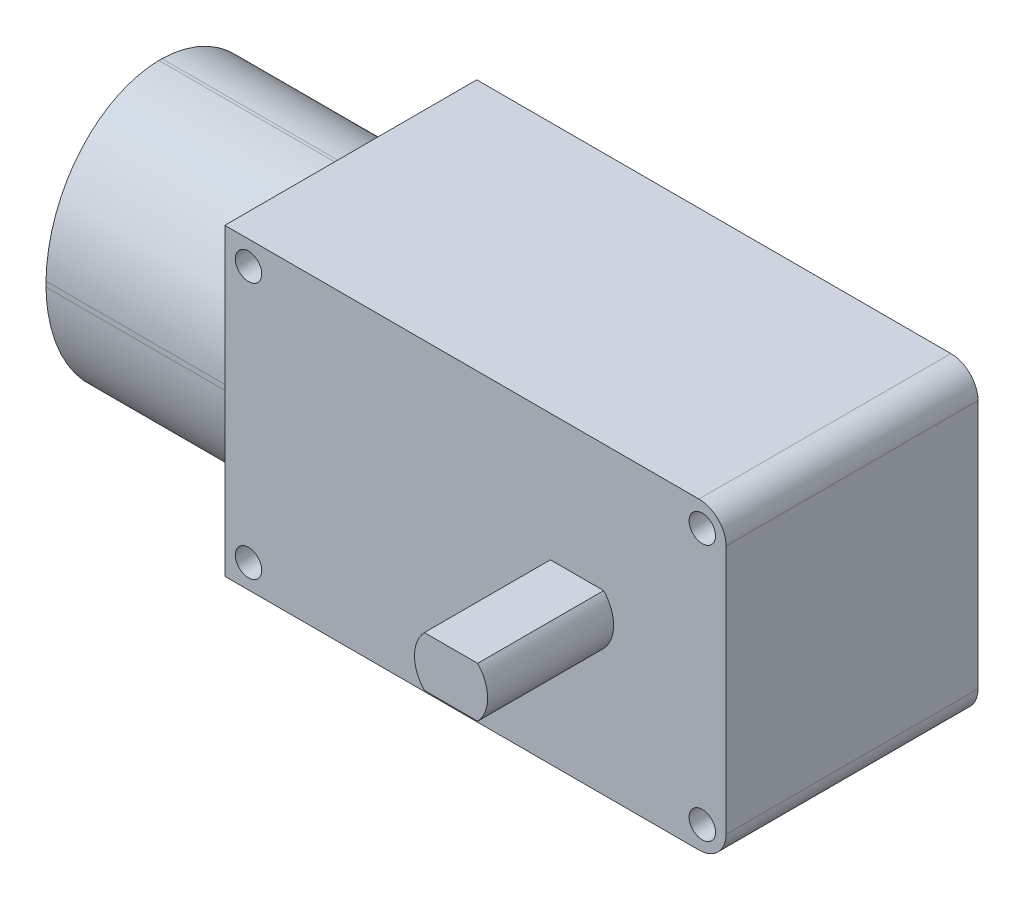
ISO-10303-21;
HEADER;
FILE_DESCRIPTION(('STEP AP214'),'2;1');
FILE_NAME('part.step','',(''),(''),'','','');
FILE_SCHEMA(('AUTOMOTIVE_DESIGN { 1 0 10303 214 1 1 1 1 }'));
ENDSEC;
DATA;
#1=APPLICATION_CONTEXT('core data for automotive mechanical design processes');
#2=APPLICATION_PROTOCOL_DEFINITION('international standard','automotive_design',2000,#1);
#3=PRODUCT_CONTEXT('',#1,'mechanical');
#4=PRODUCT('Part','Part','',(#3));
#5=PRODUCT_RELATED_PRODUCT_CATEGORY('part','',(#4));
#6=PRODUCT_DEFINITION_FORMATION('','',#4);
#7=PRODUCT_DEFINITION_CONTEXT('part definition',#1,'design');
#8=PRODUCT_DEFINITION('design','',#6,#7);
#9=PRODUCT_DEFINITION_SHAPE('','',#8);
#10=(LENGTH_UNIT() NAMED_UNIT(*) SI_UNIT(.MILLI.,.METRE.));
#11=(NAMED_UNIT(*) PLANE_ANGLE_UNIT() SI_UNIT($,.RADIAN.));
#12=(NAMED_UNIT(*) SI_UNIT($,.STERADIAN.) SOLID_ANGLE_UNIT());
#13=UNCERTAINTY_MEASURE_WITH_UNIT(LENGTH_MEASURE(1.E-05),#10,'distance_accuracy_value','');
#14=(GEOMETRIC_REPRESENTATION_CONTEXT(3) GLOBAL_UNCERTAINTY_ASSIGNED_CONTEXT((#13)) GLOBAL_UNIT_ASSIGNED_CONTEXT((#10,
#11,#12)) REPRESENTATION_CONTEXT('',''));
#15=CARTESIAN_POINT('',(0.,0.,0.));
#16=DIRECTION('',(0.,0.,1.));
#17=DIRECTION('',(1.,0.,0.));
#18=AXIS2_PLACEMENT_3D('',#15,#16,#17);
#19=CARTESIAN_POINT('',(-32.5,10.19,0.800000000000001));
#20=DIRECTION('',(0.,0.,1.));
#21=DIRECTION('',(0.,-1.,0.));
#22=AXIS2_PLACEMENT_3D('',#19,#20,#21);
#23=PLANE('',#22);
#24=DIRECTION('',(-1.,0.,0.));
#25=VECTOR('',#24,1.);
#26=CARTESIAN_POINT('',(-5.37494613522552,-0.253814280356433,0.800000000000002));
#27=LINE('',#26,#25);
#28=CARTESIAN_POINT('',(-18.5,-0.253814280356433,0.800000000000002));
#29=VERTEX_POINT('',#28);
#30=CARTESIAN_POINT('',(-32.5,-0.253814280356433,0.800000000000002));
#31=VERTEX_POINT('',#30);
#32=EDGE_CURVE('E390',#29,#31,#27,.T.);
#33=ORIENTED_EDGE('',*,*,#32,.T.);
#34=DIRECTION('',(0.,-1.,0.));
#35=VECTOR('',#34,1.);
#36=CARTESIAN_POINT('',(-32.5,10.19,0.800000000000001));
#37=LINE('',#36,#35);
#38=CARTESIAN_POINT('',(-32.5,0.135437191762646,0.800000000000002));
#39=VERTEX_POINT('',#38);
#40=EDGE_CURVE('E231',#39,#31,#37,.T.);
#41=ORIENTED_EDGE('',*,*,#40,.F.);
#42=DIRECTION('',(-1.,0.,0.));
#43=VECTOR('',#42,1.);
#44=CARTESIAN_POINT('',(-5.37494613522552,0.135437191762643,0.800000000000002));
#45=LINE('',#44,#43);
#46=CARTESIAN_POINT('',(-18.5,0.135437191762643,0.800000000000002));
#47=VERTEX_POINT('',#46);
#48=EDGE_CURVE('E387',#47,#39,#45,.T.);
#49=ORIENTED_EDGE('',*,*,#48,.F.);
#50=DIRECTION('',(0.,-1.,0.));
#51=VECTOR('',#50,1.);
#52=CARTESIAN_POINT('',(-18.5,10.19,0.800000000000001));
#53=LINE('',#52,#51);
#54=EDGE_CURVE('E235',#47,#29,#53,.T.);
#55=ORIENTED_EDGE('',*,*,#54,.T.);
#56=EDGE_LOOP('',(#33,#41,#49,#55));
#57=FACE_BOUND('',#56,.T.);
#58=ADVANCED_FACE('F51',(#57),#23,.F.);
#59=CARTESIAN_POINT('',(-32.5,-10.19,0.800000000000003));
#60=DIRECTION('',(0.,1.,0.));
#61=DIRECTION('',(0.,0.,1.));
#62=AXIS2_PLACEMENT_3D('',#59,#60,#61);
#63=PLANE('',#62);
#64=DIRECTION('',(-1.,0.,0.));
#65=VECTOR('',#64,1.);
#66=CARTESIAN_POINT('',(-5.37494613522552,-10.19,9.13763470775763));
#67=LINE('',#66,#65);
#68=CARTESIAN_POINT('',(-18.5,-10.19,9.13763470775763));
#69=VERTEX_POINT('',#68);
#70=CARTESIAN_POINT('',(-32.5,-10.19,9.13763470775763));
#71=VERTEX_POINT('',#70);
#72=EDGE_CURVE('E393',#69,#71,#67,.T.);
#73=ORIENTED_EDGE('',*,*,#72,.F.);
#74=DIRECTION('',(0.,0.,1.));
#75=VECTOR('',#74,1.);
#76=CARTESIAN_POINT('',(-18.5,-10.19,0.800000000000003));
#77=LINE('',#76,#75);
#78=CARTESIAN_POINT('',(-18.5,-10.19,9.36360232750721));
#79=VERTEX_POINT('',#78);
#80=EDGE_CURVE('E239',#69,#79,#77,.T.);
#81=ORIENTED_EDGE('',*,*,#80,.T.);
#82=DIRECTION('',(-1.,0.,0.));
#83=VECTOR('',#82,1.);
#84=CARTESIAN_POINT('',(-5.37494613522552,-10.19,9.36360232750721));
#85=LINE('',#84,#83);
#86=CARTESIAN_POINT('',(-32.5,-10.19,9.36360232750721));
#87=VERTEX_POINT('',#86);
#88=EDGE_CURVE('E769',#79,#87,#85,.T.);
#89=ORIENTED_EDGE('',*,*,#88,.T.);
#90=DIRECTION('',(0.,0.,1.));
#91=VECTOR('',#90,1.);
#92=CARTESIAN_POINT('',(-32.5,-10.19,0.800000000000003));
#93=LINE('',#92,#91);
#94=EDGE_CURVE('E225',#71,#87,#93,.T.);
#95=ORIENTED_EDGE('',*,*,#94,.F.);
#96=EDGE_LOOP('',(#73,#81,#89,#95));
#97=FACE_BOUND('',#96,.T.);
#98=ADVANCED_FACE('F451',(#97),#63,.F.);
#99=CARTESIAN_POINT('',(-32.5,10.19,17.8));
#100=DIRECTION('',(0.,0.,-1.));
#101=DIRECTION('',(0.,1.,0.));
#102=AXIS2_PLACEMENT_3D('',#99,#100,#101);
#103=PLANE('',#102);
#104=DIRECTION('',(-1.,0.,0.));
#105=VECTOR('',#104,1.);
#106=CARTESIAN_POINT('',(-5.37494613522552,-0.13543719176276,17.8));
#107=LINE('',#106,#105);
#108=CARTESIAN_POINT('',(-18.5,-0.13543719176276,17.8));
#109=VERTEX_POINT('',#108);
#110=CARTESIAN_POINT('',(-32.5,-0.135437191762757,17.8));
#111=VERTEX_POINT('',#110);
#112=EDGE_CURVE('E75',#109,#111,#107,.T.);
#113=ORIENTED_EDGE('',*,*,#112,.F.);
#114=DIRECTION('',(0.,1.,0.));
#115=VECTOR('',#114,1.);
#116=CARTESIAN_POINT('',(-18.5,10.19,17.8));
#117=LINE('',#116,#115);
#118=CARTESIAN_POINT('',(-18.5,0.253814280356199,17.8));
#119=VERTEX_POINT('',#118);
#120=EDGE_CURVE('E216',#109,#119,#117,.T.);
#121=ORIENTED_EDGE('',*,*,#120,.T.);
#122=DIRECTION('',(-1.,0.,0.));
#123=VECTOR('',#122,1.);
#124=CARTESIAN_POINT('',(-5.37494613522552,0.253814280356199,17.8));
#125=LINE('',#124,#123);
#126=CARTESIAN_POINT('',(-32.5,0.253814280356199,17.8));
#127=VERTEX_POINT('',#126);
#128=EDGE_CURVE('E202',#119,#127,#125,.T.);
#129=ORIENTED_EDGE('',*,*,#128,.T.);
#130=DIRECTION('',(0.,1.,0.));
#131=VECTOR('',#130,1.);
#132=CARTESIAN_POINT('',(-32.5,10.19,17.8));
#133=LINE('',#132,#131);
#134=EDGE_CURVE('E214',#111,#127,#133,.T.);
#135=ORIENTED_EDGE('',*,*,#134,.F.);
#136=EDGE_LOOP('',(#113,#121,#129,#135));
#137=FACE_BOUND('',#136,.T.);
#138=ADVANCED_FACE('F213',(#137),#103,.F.);
#139=CARTESIAN_POINT('',(-32.5,10.19,0.800000000000001));
#140=DIRECTION('',(0.,-1.,0.));
#141=DIRECTION('',(0.,0.,-1.));
#142=AXIS2_PLACEMENT_3D('',#139,#140,#141);
#143=PLANE('',#142);
#144=DIRECTION('',(-1.,0.,0.));
#145=VECTOR('',#144,1.);
#146=CARTESIAN_POINT('',(-5.37494613522552,10.19,9.46236529224237));
#147=LINE('',#146,#145);
#148=CARTESIAN_POINT('',(-18.5,10.19,9.46236529224237));
#149=VERTEX_POINT('',#148);
#150=CARTESIAN_POINT('',(-32.5,10.19,9.46236529224237));
#151=VERTEX_POINT('',#150);
#152=EDGE_CURVE('E67',#149,#151,#147,.T.);
#153=ORIENTED_EDGE('',*,*,#152,.F.);
#154=DIRECTION('',(0.,0.,-1.));
#155=VECTOR('',#154,1.);
#156=CARTESIAN_POINT('',(-18.5,10.19,0.800000000000001));
#157=LINE('',#156,#155);
#158=CARTESIAN_POINT('',(-18.5,10.19,9.23639767249279));
#159=VERTEX_POINT('',#158);
#160=EDGE_CURVE('E246',#149,#159,#157,.T.);
#161=ORIENTED_EDGE('',*,*,#160,.T.);
#162=DIRECTION('',(-1.,0.,0.));
#163=VECTOR('',#162,1.);
#164=CARTESIAN_POINT('',(-5.37494613522552,10.19,9.23639767249279));
#165=LINE('',#164,#163);
#166=CARTESIAN_POINT('',(-32.5,10.19,9.23639767249279));
#167=VERTEX_POINT('',#166);
#168=EDGE_CURVE('E783',#159,#167,#165,.T.);
#169=ORIENTED_EDGE('',*,*,#168,.T.);
#170=DIRECTION('',(0.,0.,-1.));
#171=VECTOR('',#170,1.);
#172=CARTESIAN_POINT('',(-32.5,10.19,0.800000000000001));
#173=LINE('',#172,#171);
#174=EDGE_CURVE('E224',#151,#167,#173,.T.);
#175=ORIENTED_EDGE('',*,*,#174,.F.);
#176=EDGE_LOOP('',(#153,#161,#169,#175));
#177=FACE_BOUND('',#176,.T.);
#178=ADVANCED_FACE('F445',(#177),#143,.F.);
#179=CARTESIAN_POINT('',(-32.5,0.,0.));
#180=DIRECTION('',(-1.,0.,0.));
#181=DIRECTION('',(0.,0.,1.));
#182=AXIS2_PLACEMENT_3D('',#179,#180,#181);
#183=PLANE('',#182);
#184=ORIENTED_EDGE('',*,*,#40,.T.);
#185=CARTESIAN_POINT('',(-32.5,0.,9.3));
#186=DIRECTION('',(-1.,0.,0.));
#187=DIRECTION('',(0.,0.999873081378272,0.0159317649718745));
#188=AXIS2_PLACEMENT_3D('',#185,#186,#187);
#189=ELLIPSE('',#188,10.1912934649202,8.50107894522293);
#190=EDGE_CURVE('E381',#31,#71,#189,.T.);
#191=ORIENTED_EDGE('',*,*,#190,.T.);
#192=ORIENTED_EDGE('',*,*,#94,.T.);
#193=CARTESIAN_POINT('',(-32.5,0.,9.3));
#194=DIRECTION('',(-1.,0.,0.));
#195=DIRECTION('',(0.,0.999873081378272,0.0159317649718745));
#196=AXIS2_PLACEMENT_3D('',#193,#194,#195);
#197=ELLIPSE('',#196,10.1912934649202,8.50107894522293);
#198=EDGE_CURVE('E222',#87,#111,#197,.T.);
#199=ORIENTED_EDGE('',*,*,#198,.T.);
#200=ORIENTED_EDGE('',*,*,#134,.T.);
#201=CARTESIAN_POINT('',(-32.5,0.,9.3));
#202=DIRECTION('',(-1.,0.,0.));
#203=DIRECTION('',(0.,0.999873081378272,0.0159317649718745));
#204=AXIS2_PLACEMENT_3D('',#201,#202,#203);
#205=ELLIPSE('',#204,10.1912934649202,8.50107894522293);
#206=EDGE_CURVE('E199',#127,#151,#205,.T.);
#207=ORIENTED_EDGE('',*,*,#206,.T.);
#208=ORIENTED_EDGE('',*,*,#174,.T.);
#209=CARTESIAN_POINT('',(-32.5,0.,9.3));
#210=DIRECTION('',(-1.,0.,0.));
#211=DIRECTION('',(0.,0.999873081378272,0.0159317649718745));
#212=AXIS2_PLACEMENT_3D('',#209,#210,#211);
#213=ELLIPSE('',#212,10.1912934649202,8.50107894522293);
#214=EDGE_CURVE('E383',#167,#39,#213,.T.);
#215=ORIENTED_EDGE('',*,*,#214,.T.);
#216=EDGE_LOOP('',(#184,#191,#192,#199,#200,#207,#208,#215));
#217=FACE_BOUND('',#216,.T.);
#218=ADVANCED_FACE('F220',(#217),#183,.T.);
#219=CARTESIAN_POINT('',(-18.5,-11.22,18.6));
#220=DIRECTION('',(0.,1.,0.));
#221=DIRECTION('',(0.,0.,1.));
#222=AXIS2_PLACEMENT_3D('',#219,#220,#221);
#223=PLANE('',#222);
#224=DIRECTION('',(1.,0.,0.));
#225=VECTOR('',#224,1.);
#226=CARTESIAN_POINT('',(-18.5,-11.22,0.));
#227=LINE('',#226,#225);
#228=CARTESIAN_POINT('',(-18.5,-11.22,0.));
#229=VERTEX_POINT('',#228);
#230=CARTESIAN_POINT('',(16.5,-11.22,0.));
#231=VERTEX_POINT('',#230);
#232=EDGE_CURVE('E229',#229,#231,#227,.T.);
#233=ORIENTED_EDGE('',*,*,#232,.T.);
#234=DIRECTION('',(0.,0.,-1.));
#235=VECTOR('',#234,1.);
#236=CARTESIAN_POINT('',(16.5,-11.22,18.6));
#237=LINE('',#236,#235);
#238=CARTESIAN_POINT('',(16.5,-11.22,18.6));
#239=VERTEX_POINT('',#238);
#240=EDGE_CURVE('E300',#231,#239,#237,.F.);
#241=ORIENTED_EDGE('',*,*,#240,.T.);
#242=DIRECTION('',(1.,0.,0.));
#243=VECTOR('',#242,1.);
#244=CARTESIAN_POINT('',(-18.5,-11.22,18.6));
#245=LINE('',#244,#243);
#246=CARTESIAN_POINT('',(-18.5,-11.22,18.6));
#247=VERTEX_POINT('',#246);
#248=EDGE_CURVE('E250',#247,#239,#245,.T.);
#249=ORIENTED_EDGE('',*,*,#248,.F.);
#250=DIRECTION('',(0.,0.,-1.));
#251=VECTOR('',#250,1.);
#252=CARTESIAN_POINT('',(-18.5,-11.22,18.6));
#253=LINE('',#252,#251);
#254=EDGE_CURVE('E267',#247,#229,#253,.T.);
#255=ORIENTED_EDGE('',*,*,#254,.T.);
#256=EDGE_LOOP('',(#233,#241,#249,#255));
#257=FACE_BOUND('',#256,.T.);
#258=ADVANCED_FACE('F444',(#257),#223,.F.);
#259=CARTESIAN_POINT('',(18.5,-11.22,18.6));
#260=DIRECTION('',(-1.,0.,0.));
#261=DIRECTION('',(0.,0.,1.));
#262=AXIS2_PLACEMENT_3D('',#259,#260,#261);
#263=PLANE('',#262);
#264=DIRECTION('',(0.,1.,0.));
#265=VECTOR('',#264,1.);
#266=CARTESIAN_POINT('',(18.5,-11.22,18.6));
#267=LINE('',#266,#265);
#268=CARTESIAN_POINT('',(18.5,-9.22,18.6));
#269=VERTEX_POINT('',#268);
#270=CARTESIAN_POINT('',(18.5,9.22,18.6));
#271=VERTEX_POINT('',#270);
#272=EDGE_CURVE('E254',#269,#271,#267,.T.);
#273=ORIENTED_EDGE('',*,*,#272,.F.);
#274=DIRECTION('',(0.,0.,-1.));
#275=VECTOR('',#274,1.);
#276=CARTESIAN_POINT('',(18.5,-9.22,18.6));
#277=LINE('',#276,#275);
#278=CARTESIAN_POINT('',(18.5,-9.22,0.));
#279=VERTEX_POINT('',#278);
#280=EDGE_CURVE('E290',#269,#279,#277,.T.);
#281=ORIENTED_EDGE('',*,*,#280,.T.);
#282=DIRECTION('',(0.,1.,0.));
#283=VECTOR('',#282,1.);
#284=CARTESIAN_POINT('',(18.5,-11.22,0.));
#285=LINE('',#284,#283);
#286=CARTESIAN_POINT('',(18.5,9.22,0.));
#287=VERTEX_POINT('',#286);
#288=EDGE_CURVE('E271',#279,#287,#285,.T.);
#289=ORIENTED_EDGE('',*,*,#288,.T.);
#290=DIRECTION('',(0.,0.,-1.));
#291=VECTOR('',#290,1.);
#292=CARTESIAN_POINT('',(18.5,9.22,18.6));
#293=LINE('',#292,#291);
#294=EDGE_CURVE('E287',#287,#271,#293,.F.);
#295=ORIENTED_EDGE('',*,*,#294,.T.);
#296=EDGE_LOOP('',(#273,#281,#289,#295));
#297=FACE_BOUND('',#296,.T.);
#298=ADVANCED_FACE('F472',(#297),#263,.F.);
#299=CARTESIAN_POINT('',(-18.5,11.22,18.6));
#300=DIRECTION('',(0.,1.,0.));
#301=DIRECTION('',(0.,0.,1.));
#302=AXIS2_PLACEMENT_3D('',#299,#300,#301);
#303=PLANE('',#302);
#304=DIRECTION('',(1.,0.,0.));
#305=VECTOR('',#304,1.);
#306=CARTESIAN_POINT('',(-18.5,11.22,18.6));
#307=LINE('',#306,#305);
#308=CARTESIAN_POINT('',(-18.5,11.22,18.6));
#309=VERTEX_POINT('',#308);
#310=CARTESIAN_POINT('',(16.5,11.22,18.6));
#311=VERTEX_POINT('',#310);
#312=EDGE_CURVE('E259',#309,#311,#307,.T.);
#313=ORIENTED_EDGE('',*,*,#312,.T.);
#314=DIRECTION('',(0.,0.,-1.));
#315=VECTOR('',#314,1.);
#316=CARTESIAN_POINT('',(16.5,11.22,0.));
#317=LINE('',#316,#315);
#318=CARTESIAN_POINT('',(16.5,11.22,0.));
#319=VERTEX_POINT('',#318);
#320=EDGE_CURVE('E309',#311,#319,#317,.T.);
#321=ORIENTED_EDGE('',*,*,#320,.T.);
#322=DIRECTION('',(1.,0.,0.));
#323=VECTOR('',#322,1.);
#324=CARTESIAN_POINT('',(-18.5,11.22,0.));
#325=LINE('',#324,#323);
#326=CARTESIAN_POINT('',(-18.5,11.22,0.));
#327=VERTEX_POINT('',#326);
#328=EDGE_CURVE('E275',#327,#319,#325,.T.);
#329=ORIENTED_EDGE('',*,*,#328,.F.);
#330=DIRECTION('',(0.,0.,-1.));
#331=VECTOR('',#330,1.);
#332=CARTESIAN_POINT('',(-18.5,11.22,18.6));
#333=LINE('',#332,#331);
#334=EDGE_CURVE('E284',#309,#327,#333,.T.);
#335=ORIENTED_EDGE('',*,*,#334,.F.);
#336=EDGE_LOOP('',(#313,#321,#329,#335));
#337=FACE_BOUND('',#336,.T.);
#338=ADVANCED_FACE('F468',(#337),#303,.T.);
#339=CARTESIAN_POINT('',(-18.5,-11.22,18.6));
#340=DIRECTION('',(-1.,0.,0.));
#341=DIRECTION('',(0.,0.,1.));
#342=AXIS2_PLACEMENT_3D('',#339,#340,#341);
#343=PLANE('',#342);
#344=CARTESIAN_POINT('',(-18.5,0.,9.3));
#345=DIRECTION('',(-1.,0.,0.));
#346=DIRECTION('',(0.,0.999873081378272,0.0159317649718745));
#347=AXIS2_PLACEMENT_3D('',#344,#345,#346);
#348=ELLIPSE('',#347,10.1912934649202,8.50107894522293);
#349=EDGE_CURVE('E397',#69,#29,#348,.F.);
#350=ORIENTED_EDGE('',*,*,#349,.T.);
#351=ORIENTED_EDGE('',*,*,#54,.F.);
#352=CARTESIAN_POINT('',(-18.5,0.,9.3));
#353=DIRECTION('',(-1.,0.,0.));
#354=DIRECTION('',(0.,0.999873081378272,0.0159317649718745));
#355=AXIS2_PLACEMENT_3D('',#352,#353,#354);
#356=ELLIPSE('',#355,10.1912934649202,8.50107894522293);
#357=EDGE_CURVE('E402',#47,#159,#356,.F.);
#358=ORIENTED_EDGE('',*,*,#357,.T.);
#359=ORIENTED_EDGE('',*,*,#160,.F.);
#360=CARTESIAN_POINT('',(-18.5,0.,9.3));
#361=DIRECTION('',(-1.,0.,0.));
#362=DIRECTION('',(0.,0.999873081378272,0.0159317649718745));
#363=AXIS2_PLACEMENT_3D('',#360,#361,#362);
#364=ELLIPSE('',#363,10.1912934649202,8.50107894522293);
#365=EDGE_CURVE('E759',#149,#119,#364,.F.);
#366=ORIENTED_EDGE('',*,*,#365,.T.);
#367=ORIENTED_EDGE('',*,*,#120,.F.);
#368=CARTESIAN_POINT('',(-18.5,0.,9.3));
#369=DIRECTION('',(-1.,0.,0.));
#370=DIRECTION('',(0.,0.999873081378272,0.0159317649718745));
#371=AXIS2_PLACEMENT_3D('',#368,#369,#370);
#372=ELLIPSE('',#371,10.1912934649202,8.50107894522293);
#373=EDGE_CURVE('E209',#109,#79,#372,.F.);
#374=ORIENTED_EDGE('',*,*,#373,.T.);
#375=ORIENTED_EDGE('',*,*,#80,.F.);
#376=EDGE_LOOP('',(#350,#351,#358,#359,#366,#367,#374,#375));
#377=FACE_BOUND('',#376,.T.);
#378=DIRECTION('',(0.,1.,0.));
#379=VECTOR('',#378,1.);
#380=CARTESIAN_POINT('',(-18.5,-11.22,0.));
#381=LINE('',#380,#379);
#382=EDGE_CURVE('E255',#229,#327,#381,.T.);
#383=ORIENTED_EDGE('',*,*,#382,.F.);
#384=ORIENTED_EDGE('',*,*,#254,.F.);
#385=DIRECTION('',(0.,1.,0.));
#386=VECTOR('',#385,1.);
#387=CARTESIAN_POINT('',(-18.5,-11.22,18.6));
#388=LINE('',#387,#386);
#389=EDGE_CURVE('E263',#247,#309,#388,.T.);
#390=ORIENTED_EDGE('',*,*,#389,.T.);
#391=ORIENTED_EDGE('',*,*,#334,.T.);
#392=EDGE_LOOP('',(#383,#384,#390,#391));
#393=FACE_BOUND('',#392,.T.);
#394=ADVANCED_FACE('F460',(#377,#393),#343,.T.);
#395=CARTESIAN_POINT('',(0.,0.,18.6));
#396=DIRECTION('',(0.,0.,1.));
#397=DIRECTION('',(1.,0.,0.));
#398=AXIS2_PLACEMENT_3D('',#395,#396,#397);
#399=PLANE('',#398);
#400=CARTESIAN_POINT('',(-16.75,9.47,18.6));
#401=DIRECTION('',(0.,0.,1.));
#402=DIRECTION('',(1.,0.,0.));
#403=AXIS2_PLACEMENT_3D('',#400,#401,#402);
#404=CIRCLE('',#403,0.975);
#405=CARTESIAN_POINT('',(-15.775,9.47,18.6));
#406=VERTEX_POINT('',#405);
#407=EDGE_CURVE('E399',#406,#406,#404,.T.);
#408=ORIENTED_EDGE('',*,*,#407,.F.);
#409=EDGE_LOOP('',(#408));
#410=FACE_BOUND('',#409,.T.);
#411=CARTESIAN_POINT('',(-16.75,-9.47,18.6));
#412=DIRECTION('',(0.,0.,1.));
#413=DIRECTION('',(1.,0.,0.));
#414=AXIS2_PLACEMENT_3D('',#411,#412,#413);
#415=CIRCLE('',#414,0.975);
#416=CARTESIAN_POINT('',(-15.775,-9.47,18.6));
#417=VERTEX_POINT('',#416);
#418=EDGE_CURVE('E830',#417,#417,#415,.T.);
#419=ORIENTED_EDGE('',*,*,#418,.F.);
#420=EDGE_LOOP('',(#419));
#421=FACE_BOUND('',#420,.T.);
#422=CARTESIAN_POINT('',(16.75,-9.47,18.6));
#423=DIRECTION('',(0.,0.,1.));
#424=DIRECTION('',(1.,0.,0.));
#425=AXIS2_PLACEMENT_3D('',#422,#423,#424);
#426=CIRCLE('',#425,0.975);
#427=CARTESIAN_POINT('',(17.725,-9.47,18.6));
#428=VERTEX_POINT('',#427);
#429=EDGE_CURVE('E834',#428,#428,#426,.T.);
#430=ORIENTED_EDGE('',*,*,#429,.F.);
#431=EDGE_LOOP('',(#430));
#432=FACE_BOUND('',#431,.T.);
#433=CARTESIAN_POINT('',(16.75,9.47,18.6));
#434=DIRECTION('',(0.,0.,1.));
#435=DIRECTION('',(1.,0.,0.));
#436=AXIS2_PLACEMENT_3D('',#433,#434,#435);
#437=CIRCLE('',#436,0.975);
#438=CARTESIAN_POINT('',(17.725,9.47,18.6));
#439=VERTEX_POINT('',#438);
#440=EDGE_CURVE('E838',#439,#439,#437,.T.);
#441=ORIENTED_EDGE('',*,*,#440,.F.);
#442=EDGE_LOOP('',(#441));
#443=FACE_BOUND('',#442,.T.);
#444=CARTESIAN_POINT('',(7.5,0.,18.6));
#445=DIRECTION('',(0.,0.,1.));
#446=DIRECTION('',(1.,0.,0.));
#447=AXIS2_PLACEMENT_3D('',#444,#445,#446);
#448=CIRCLE('',#447,2.7);
#449=CARTESIAN_POINT('',(5.53340395607028,1.85,18.6));
#450=VERTEX_POINT('',#449);
#451=CARTESIAN_POINT('',(5.53340395607028,-1.85,18.6));
#452=VERTEX_POINT('',#451);
#453=EDGE_CURVE('E240',#450,#452,#448,.T.);
#454=ORIENTED_EDGE('',*,*,#453,.F.);
#455=DIRECTION('',(1.,0.,0.));
#456=VECTOR('',#455,1.);
#457=CARTESIAN_POINT('',(0.,1.85,18.6));
#458=LINE('',#457,#456);
#459=CARTESIAN_POINT('',(9.46659604392971,1.85,18.6));
#460=VERTEX_POINT('',#459);
#461=EDGE_CURVE('E372',#450,#460,#458,.T.);
#462=ORIENTED_EDGE('',*,*,#461,.T.);
#463=CARTESIAN_POINT('',(7.5,0.,18.6));
#464=DIRECTION('',(0.,0.,1.));
#465=DIRECTION('',(1.,0.,0.));
#466=AXIS2_PLACEMENT_3D('',#463,#464,#465);
#467=CIRCLE('',#466,2.7);
#468=CARTESIAN_POINT('',(9.46659604392971,-1.85,18.6));
#469=VERTEX_POINT('',#468);
#470=EDGE_CURVE('E368',#469,#460,#467,.T.);
#471=ORIENTED_EDGE('',*,*,#470,.F.);
#472=DIRECTION('',(1.,0.,0.));
#473=VECTOR('',#472,1.);
#474=CARTESIAN_POINT('',(0.,-1.85,18.6));
#475=LINE('',#474,#473);
#476=EDGE_CURVE('E364',#452,#469,#475,.T.);
#477=ORIENTED_EDGE('',*,*,#476,.F.);
#478=EDGE_LOOP('',(#454,#462,#471,#477));
#479=FACE_BOUND('',#478,.T.);
#480=ORIENTED_EDGE('',*,*,#248,.T.);
#481=CARTESIAN_POINT('',(16.5,-9.22,18.6));
#482=DIRECTION('',(0.,0.,1.));
#483=DIRECTION('',(1.,0.,0.));
#484=AXIS2_PLACEMENT_3D('',#481,#482,#483);
#485=CIRCLE('',#484,2.);
#486=EDGE_CURVE('E306',#239,#269,#485,.T.);
#487=ORIENTED_EDGE('',*,*,#486,.T.);
#488=ORIENTED_EDGE('',*,*,#272,.T.);
#489=CARTESIAN_POINT('',(16.5,9.22,18.6));
#490=DIRECTION('',(0.,0.,1.));
#491=DIRECTION('',(1.,0.,0.));
#492=AXIS2_PLACEMENT_3D('',#489,#490,#491);
#493=CIRCLE('',#492,2.);
#494=EDGE_CURVE('E303',#271,#311,#493,.T.);
#495=ORIENTED_EDGE('',*,*,#494,.T.);
#496=ORIENTED_EDGE('',*,*,#312,.F.);
#497=ORIENTED_EDGE('',*,*,#389,.F.);
#498=EDGE_LOOP('',(#480,#487,#488,#495,#496,#497));
#499=FACE_BOUND('',#498,.T.);
#500=ADVANCED_FACE('F457',(#410,#421,#432,#443,#479,#499),#399,.T.);
#501=CARTESIAN_POINT('',(0.,0.,0.));
#502=DIRECTION('',(0.,0.,1.));
#503=DIRECTION('',(1.,0.,0.));
#504=AXIS2_PLACEMENT_3D('',#501,#502,#503);
#505=PLANE('',#504);
#506=CARTESIAN_POINT('',(-16.75,9.47,0.));
#507=DIRECTION('',(0.,0.,-1.));
#508=DIRECTION('',(-1.,0.,0.));
#509=AXIS2_PLACEMENT_3D('',#506,#507,#508);
#510=CIRCLE('',#509,0.975);
#511=CARTESIAN_POINT('',(-17.725,9.47,0.));
#512=VERTEX_POINT('',#511);
#513=EDGE_CURVE('E847',#512,#512,#510,.T.);
#514=ORIENTED_EDGE('',*,*,#513,.F.);
#515=EDGE_LOOP('',(#514));
#516=FACE_BOUND('',#515,.T.);
#517=CARTESIAN_POINT('',(-16.75,-9.47,0.));
#518=DIRECTION('',(0.,0.,-1.));
#519=DIRECTION('',(-1.,0.,0.));
#520=AXIS2_PLACEMENT_3D('',#517,#518,#519);
#521=CIRCLE('',#520,0.975);
#522=CARTESIAN_POINT('',(-17.725,-9.47,0.));
#523=VERTEX_POINT('',#522);
#524=EDGE_CURVE('E851',#523,#523,#521,.T.);
#525=ORIENTED_EDGE('',*,*,#524,.F.);
#526=EDGE_LOOP('',(#525));
#527=FACE_BOUND('',#526,.T.);
#528=CARTESIAN_POINT('',(16.75,-9.47,0.));
#529=DIRECTION('',(0.,0.,-1.));
#530=DIRECTION('',(-1.,0.,0.));
#531=AXIS2_PLACEMENT_3D('',#528,#529,#530);
#532=CIRCLE('',#531,0.975);
#533=CARTESIAN_POINT('',(15.775,-9.47,0.));
#534=VERTEX_POINT('',#533);
#535=EDGE_CURVE('E846',#534,#534,#532,.T.);
#536=ORIENTED_EDGE('',*,*,#535,.F.);
#537=EDGE_LOOP('',(#536));
#538=FACE_BOUND('',#537,.T.);
#539=CARTESIAN_POINT('',(16.75,9.47,0.));
#540=DIRECTION('',(0.,0.,-1.));
#541=DIRECTION('',(-1.,0.,0.));
#542=AXIS2_PLACEMENT_3D('',#539,#540,#541);
#543=CIRCLE('',#542,0.975);
#544=CARTESIAN_POINT('',(15.775,9.47,0.));
#545=VERTEX_POINT('',#544);
#546=EDGE_CURVE('E842',#545,#545,#543,.T.);
#547=ORIENTED_EDGE('',*,*,#546,.F.);
#548=EDGE_LOOP('',(#547));
#549=FACE_BOUND('',#548,.T.);
#550=DIRECTION('',(1.,0.,0.));
#551=VECTOR('',#550,1.);
#552=CARTESIAN_POINT('',(0.,1.85,0.));
#553=LINE('',#552,#551);
#554=CARTESIAN_POINT('',(5.53340395607028,1.85,0.));
#555=VERTEX_POINT('',#554);
#556=CARTESIAN_POINT('',(9.46659604392971,1.85,0.));
#557=VERTEX_POINT('',#556);
#558=EDGE_CURVE('E60',#555,#557,#553,.T.);
#559=ORIENTED_EDGE('',*,*,#558,.F.);
#560=CARTESIAN_POINT('',(7.5,0.,0.));
#561=DIRECTION('',(0.,0.,1.));
#562=DIRECTION('',(1.,0.,0.));
#563=AXIS2_PLACEMENT_3D('',#560,#561,#562);
#564=CIRCLE('',#563,2.7);
#565=CARTESIAN_POINT('',(5.53340395607028,-1.85,0.));
#566=VERTEX_POINT('',#565);
#567=EDGE_CURVE('E11',#555,#566,#564,.T.);
#568=ORIENTED_EDGE('',*,*,#567,.T.);
#569=DIRECTION('',(1.,0.,0.));
#570=VECTOR('',#569,1.);
#571=CARTESIAN_POINT('',(0.,-1.85,0.));
#572=LINE('',#571,#570);
#573=CARTESIAN_POINT('',(9.46659604392971,-1.85,0.));
#574=VERTEX_POINT('',#573);
#575=EDGE_CURVE('E313',#566,#574,#572,.T.);
#576=ORIENTED_EDGE('',*,*,#575,.T.);
#577=CARTESIAN_POINT('',(7.5,0.,0.));
#578=DIRECTION('',(0.,0.,1.));
#579=DIRECTION('',(1.,0.,0.));
#580=AXIS2_PLACEMENT_3D('',#577,#578,#579);
#581=CIRCLE('',#580,2.7);
#582=EDGE_CURVE('E317',#574,#557,#581,.T.);
#583=ORIENTED_EDGE('',*,*,#582,.T.);
#584=EDGE_LOOP('',(#559,#568,#576,#583));
#585=FACE_BOUND('',#584,.T.);
#586=ORIENTED_EDGE('',*,*,#288,.F.);
#587=CARTESIAN_POINT('',(16.5,-9.22,0.));
#588=DIRECTION('',(0.,0.,1.));
#589=DIRECTION('',(1.,0.,0.));
#590=AXIS2_PLACEMENT_3D('',#587,#588,#589);
#591=CIRCLE('',#590,2.);
#592=EDGE_CURVE('E297',#279,#231,#591,.F.);
#593=ORIENTED_EDGE('',*,*,#592,.T.);
#594=ORIENTED_EDGE('',*,*,#232,.F.);
#595=ORIENTED_EDGE('',*,*,#382,.T.);
#596=ORIENTED_EDGE('',*,*,#328,.T.);
#597=CARTESIAN_POINT('',(16.5,9.22,0.));
#598=DIRECTION('',(0.,0.,1.));
#599=DIRECTION('',(1.,0.,0.));
#600=AXIS2_PLACEMENT_3D('',#597,#598,#599);
#601=CIRCLE('',#600,2.);
#602=EDGE_CURVE('E294',#319,#287,#601,.F.);
#603=ORIENTED_EDGE('',*,*,#602,.T.);
#604=EDGE_LOOP('',(#586,#593,#594,#595,#596,#603));
#605=FACE_BOUND('',#604,.T.);
#606=ADVANCED_FACE('F341',(#516,#527,#538,#549,#585,#605),#505,.F.);
#607=CARTESIAN_POINT('',(16.5,-9.22,18.6));
#608=DIRECTION('',(0.,0.,-1.));
#609=DIRECTION('',(-1.,0.,0.));
#610=AXIS2_PLACEMENT_3D('',#607,#608,#609);
#611=CYLINDRICAL_SURFACE('',#610,2.);
#612=ORIENTED_EDGE('',*,*,#486,.F.);
#613=ORIENTED_EDGE('',*,*,#240,.F.);
#614=ORIENTED_EDGE('',*,*,#592,.F.);
#615=ORIENTED_EDGE('',*,*,#280,.F.);
#616=EDGE_LOOP('',(#612,#613,#614,#615));
#617=FACE_BOUND('',#616,.T.);
#618=ADVANCED_FACE('F464',(#617),#611,.T.);
#619=CARTESIAN_POINT('',(16.5,9.22,18.6));
#620=DIRECTION('',(0.,0.,1.));
#621=DIRECTION('',(1.,0.,0.));
#622=AXIS2_PLACEMENT_3D('',#619,#620,#621);
#623=CYLINDRICAL_SURFACE('',#622,2.);
#624=ORIENTED_EDGE('',*,*,#494,.F.);
#625=ORIENTED_EDGE('',*,*,#294,.F.);
#626=ORIENTED_EDGE('',*,*,#602,.F.);
#627=ORIENTED_EDGE('',*,*,#320,.F.);
#628=EDGE_LOOP('',(#624,#625,#626,#627));
#629=FACE_BOUND('',#628,.T.);
#630=ADVANCED_FACE('F53',(#629),#623,.T.);
#631=CARTESIAN_POINT('',(7.5,0.,-8.1));
#632=DIRECTION('',(0.,0.,1.));
#633=DIRECTION('',(1.,0.,0.));
#634=AXIS2_PLACEMENT_3D('',#631,#632,#633);
#635=PLANE('',#634);
#636=CARTESIAN_POINT('',(7.5,0.,-8.1));
#637=DIRECTION('',(0.,0.,1.));
#638=DIRECTION('',(1.,0.,0.));
#639=AXIS2_PLACEMENT_3D('',#636,#637,#638);
#640=CIRCLE('',#639,2.7);
#641=CARTESIAN_POINT('',(5.53340395607028,1.85,-8.1));
#642=VERTEX_POINT('',#641);
#643=CARTESIAN_POINT('',(5.53340395607028,-1.85,-8.1));
#644=VERTEX_POINT('',#643);
#645=EDGE_CURVE('E354',#642,#644,#640,.T.);
#646=ORIENTED_EDGE('',*,*,#645,.F.);
#647=DIRECTION('',(1.,0.,0.));
#648=VECTOR('',#647,1.);
#649=CARTESIAN_POINT('',(5.53340395607028,1.85,-8.1));
#650=LINE('',#649,#648);
#651=CARTESIAN_POINT('',(9.46659604392971,1.85,-8.1));
#652=VERTEX_POINT('',#651);
#653=EDGE_CURVE('E362',#642,#652,#650,.T.);
#654=ORIENTED_EDGE('',*,*,#653,.T.);
#655=CARTESIAN_POINT('',(7.5,0.,-8.1));
#656=DIRECTION('',(0.,0.,1.));
#657=DIRECTION('',(1.,0.,0.));
#658=AXIS2_PLACEMENT_3D('',#655,#656,#657);
#659=CIRCLE('',#658,2.7);
#660=CARTESIAN_POINT('',(9.46659604392971,-1.85,-8.1));
#661=VERTEX_POINT('',#660);
#662=EDGE_CURVE('E336',#661,#652,#659,.T.);
#663=ORIENTED_EDGE('',*,*,#662,.F.);
#664=DIRECTION('',(1.,0.,0.));
#665=VECTOR('',#664,1.);
#666=CARTESIAN_POINT('',(5.53340395607028,-1.85,-8.1));
#667=LINE('',#666,#665);
#668=EDGE_CURVE('E807',#644,#661,#667,.T.);
#669=ORIENTED_EDGE('',*,*,#668,.F.);
#670=EDGE_LOOP('',(#646,#654,#663,#669));
#671=FACE_BOUND('',#670,.T.);
#672=ADVANCED_FACE('F423',(#671),#635,.F.);
#673=CARTESIAN_POINT('',(5.53340395607028,-1.85,-8.1));
#674=DIRECTION('',(0.,-1.,0.));
#675=DIRECTION('',(1.,0.,0.));
#676=AXIS2_PLACEMENT_3D('',#673,#674,#675);
#677=PLANE('',#676);
#678=ORIENTED_EDGE('',*,*,#575,.F.);
#679=DIRECTION('',(0.,0.,1.));
#680=VECTOR('',#679,1.);
#681=CARTESIAN_POINT('',(5.53340395607028,-1.85,-8.1));
#682=LINE('',#681,#680);
#683=EDGE_CURVE('E347',#644,#566,#682,.T.);
#684=ORIENTED_EDGE('',*,*,#683,.F.);
#685=ORIENTED_EDGE('',*,*,#668,.T.);
#686=DIRECTION('',(0.,0.,1.));
#687=VECTOR('',#686,1.);
#688=CARTESIAN_POINT('',(9.46659604392971,-1.85,-8.1));
#689=LINE('',#688,#687);
#690=EDGE_CURVE('E349',#661,#574,#689,.T.);
#691=ORIENTED_EDGE('',*,*,#690,.T.);
#692=EDGE_LOOP('',(#678,#684,#685,#691));
#693=FACE_BOUND('',#692,.T.);
#694=ADVANCED_FACE('F345',(#693),#677,.T.);
#695=CARTESIAN_POINT('',(7.5,0.,-8.1));
#696=DIRECTION('',(0.,0.,1.));
#697=DIRECTION('',(1.,0.,0.));
#698=AXIS2_PLACEMENT_3D('',#695,#696,#697);
#699=CYLINDRICAL_SURFACE('',#698,2.7);
#700=ORIENTED_EDGE('',*,*,#582,.F.);
#701=ORIENTED_EDGE('',*,*,#690,.F.);
#702=ORIENTED_EDGE('',*,*,#662,.T.);
#703=DIRECTION('',(0.,0.,1.));
#704=VECTOR('',#703,1.);
#705=CARTESIAN_POINT('',(9.46659604392971,1.85,-8.1));
#706=LINE('',#705,#704);
#707=EDGE_CURVE('E328',#652,#557,#706,.T.);
#708=ORIENTED_EDGE('',*,*,#707,.T.);
#709=EDGE_LOOP('',(#700,#701,#702,#708));
#710=FACE_BOUND('',#709,.T.);
#711=ADVANCED_FACE('F334',(#710),#699,.T.);
#712=CARTESIAN_POINT('',(5.53340395607028,1.85,-8.1));
#713=DIRECTION('',(0.,-1.,0.));
#714=DIRECTION('',(0.,0.,-1.));
#715=AXIS2_PLACEMENT_3D('',#712,#713,#714);
#716=PLANE('',#715);
#717=DIRECTION('',(0.,0.,1.));
#718=VECTOR('',#717,1.);
#719=CARTESIAN_POINT('',(5.53340395607028,1.85,-8.1));
#720=LINE('',#719,#718);
#721=EDGE_CURVE('E330',#642,#555,#720,.T.);
#722=ORIENTED_EDGE('',*,*,#721,.T.);
#723=ORIENTED_EDGE('',*,*,#558,.T.);
#724=ORIENTED_EDGE('',*,*,#707,.F.);
#725=ORIENTED_EDGE('',*,*,#653,.F.);
#726=EDGE_LOOP('',(#722,#723,#724,#725));
#727=FACE_BOUND('',#726,.T.);
#728=ADVANCED_FACE('F326',(#727),#716,.F.);
#729=CARTESIAN_POINT('',(7.5,0.,-8.1));
#730=DIRECTION('',(0.,0.,1.));
#731=DIRECTION('',(1.,0.,0.));
#732=AXIS2_PLACEMENT_3D('',#729,#730,#731);
#733=CYLINDRICAL_SURFACE('',#732,2.7);
#734=ORIENTED_EDGE('',*,*,#567,.F.);
#735=ORIENTED_EDGE('',*,*,#721,.F.);
#736=ORIENTED_EDGE('',*,*,#645,.T.);
#737=ORIENTED_EDGE('',*,*,#683,.T.);
#738=EDGE_LOOP('',(#734,#735,#736,#737));
#739=FACE_BOUND('',#738,.T.);
#740=ADVANCED_FACE('F352',(#739),#733,.T.);
#741=CARTESIAN_POINT('',(5.53340395607028,1.85,27.9));
#742=VERTEX_POINT('',#741);
#743=EDGE_CURVE('E338',#450,#742,#720,.T.);
#744=ORIENTED_EDGE('',*,*,#743,.F.);
#745=ORIENTED_EDGE('',*,*,#453,.T.);
#746=CARTESIAN_POINT('',(5.53340395607028,-1.85,27.9));
#747=VERTEX_POINT('',#746);
#748=EDGE_CURVE('E357',#452,#747,#682,.T.);
#749=ORIENTED_EDGE('',*,*,#748,.T.);
#750=CARTESIAN_POINT('',(7.5,0.,27.9));
#751=DIRECTION('',(0.,0.,1.));
#752=DIRECTION('',(1.,0.,0.));
#753=AXIS2_PLACEMENT_3D('',#750,#751,#752);
#754=CIRCLE('',#753,2.7);
#755=EDGE_CURVE('E405',#742,#747,#754,.T.);
#756=ORIENTED_EDGE('',*,*,#755,.F.);
#757=EDGE_LOOP('',(#744,#745,#749,#756));
#758=FACE_BOUND('',#757,.T.);
#759=ADVANCED_FACE('F431',(#758),#733,.T.);
#760=ORIENTED_EDGE('',*,*,#461,.F.);
#761=ORIENTED_EDGE('',*,*,#743,.T.);
#762=DIRECTION('',(1.,0.,0.));
#763=VECTOR('',#762,1.);
#764=CARTESIAN_POINT('',(5.53340395607028,1.85,27.9));
#765=LINE('',#764,#763);
#766=CARTESIAN_POINT('',(9.46659604392971,1.85,27.9));
#767=VERTEX_POINT('',#766);
#768=EDGE_CURVE('E801',#742,#767,#765,.T.);
#769=ORIENTED_EDGE('',*,*,#768,.T.);
#770=EDGE_CURVE('E339',#460,#767,#706,.T.);
#771=ORIENTED_EDGE('',*,*,#770,.F.);
#772=EDGE_LOOP('',(#760,#761,#769,#771));
#773=FACE_BOUND('',#772,.T.);
#774=ADVANCED_FACE('F427',(#773),#716,.F.);
#775=CARTESIAN_POINT('',(9.46659604392971,-1.85,27.9));
#776=VERTEX_POINT('',#775);
#777=EDGE_CURVE('E356',#469,#776,#689,.T.);
#778=ORIENTED_EDGE('',*,*,#777,.F.);
#779=ORIENTED_EDGE('',*,*,#470,.T.);
#780=ORIENTED_EDGE('',*,*,#770,.T.);
#781=CARTESIAN_POINT('',(7.5,0.,27.9));
#782=DIRECTION('',(0.,0.,1.));
#783=DIRECTION('',(1.,0.,0.));
#784=AXIS2_PLACEMENT_3D('',#781,#782,#783);
#785=CIRCLE('',#784,2.7);
#786=EDGE_CURVE('E797',#776,#767,#785,.T.);
#787=ORIENTED_EDGE('',*,*,#786,.F.);
#788=EDGE_LOOP('',(#778,#779,#780,#787));
#789=FACE_BOUND('',#788,.T.);
#790=ADVANCED_FACE('F430',(#789),#699,.T.);
#791=ORIENTED_EDGE('',*,*,#748,.F.);
#792=ORIENTED_EDGE('',*,*,#476,.T.);
#793=ORIENTED_EDGE('',*,*,#777,.T.);
#794=DIRECTION('',(1.,0.,0.));
#795=VECTOR('',#794,1.);
#796=CARTESIAN_POINT('',(5.53340395607028,-1.85,27.9));
#797=LINE('',#796,#795);
#798=EDGE_CURVE('E793',#747,#776,#797,.T.);
#799=ORIENTED_EDGE('',*,*,#798,.F.);
#800=EDGE_LOOP('',(#791,#792,#793,#799));
#801=FACE_BOUND('',#800,.T.);
#802=ADVANCED_FACE('F421',(#801),#677,.T.);
#803=CARTESIAN_POINT('',(7.5,0.,27.9));
#804=DIRECTION('',(0.,0.,1.));
#805=DIRECTION('',(1.,0.,0.));
#806=AXIS2_PLACEMENT_3D('',#803,#804,#805);
#807=PLANE('',#806);
#808=ORIENTED_EDGE('',*,*,#755,.T.);
#809=ORIENTED_EDGE('',*,*,#798,.T.);
#810=ORIENTED_EDGE('',*,*,#786,.T.);
#811=ORIENTED_EDGE('',*,*,#768,.F.);
#812=EDGE_LOOP('',(#808,#809,#810,#811));
#813=FACE_BOUND('',#812,.T.);
#814=ADVANCED_FACE('F414',(#813),#807,.T.);
#815=CARTESIAN_POINT('',(-5.37494613522552,0.,9.3));
#816=DIRECTION('',(-1.,0.,0.));
#817=DIRECTION('',(0.,0.999873081378272,0.0159317649718745));
#818=AXIS2_PLACEMENT_3D('',#815,#816,#817);
#819=ELLIPSE('',#818,10.1912934649202,8.50107894522293);
#820=DIRECTION('',(-1.,0.,0.));
#821=VECTOR('',#820,1.);
#822=SURFACE_OF_LINEAR_EXTRUSION('',#819,#821);
#823=ORIENTED_EDGE('',*,*,#48,.T.);
#824=ORIENTED_EDGE('',*,*,#214,.F.);
#825=ORIENTED_EDGE('',*,*,#168,.F.);
#826=ORIENTED_EDGE('',*,*,#357,.F.);
#827=EDGE_LOOP('',(#823,#824,#825,#826));
#828=FACE_BOUND('',#827,.T.);
#829=ADVANCED_FACE('F410',(#828),#822,.T.);
#830=CARTESIAN_POINT('',(-5.37494613522552,0.,9.3));
#831=DIRECTION('',(-1.,0.,0.));
#832=DIRECTION('',(0.,0.999873081378272,0.0159317649718745));
#833=AXIS2_PLACEMENT_3D('',#830,#831,#832);
#834=ELLIPSE('',#833,10.1912934649202,8.50107894522293);
#835=DIRECTION('',(-1.,0.,0.));
#836=VECTOR('',#835,1.);
#837=SURFACE_OF_LINEAR_EXTRUSION('',#834,#836);
#838=ORIENTED_EDGE('',*,*,#152,.T.);
#839=ORIENTED_EDGE('',*,*,#206,.F.);
#840=ORIENTED_EDGE('',*,*,#128,.F.);
#841=ORIENTED_EDGE('',*,*,#365,.F.);
#842=EDGE_LOOP('',(#838,#839,#840,#841));
#843=FACE_BOUND('',#842,.T.);
#844=ADVANCED_FACE('F201',(#843),#837,.T.);
#845=CARTESIAN_POINT('',(-5.37494613522552,0.,9.3));
#846=DIRECTION('',(-1.,0.,0.));
#847=DIRECTION('',(0.,0.999873081378272,0.0159317649718745));
#848=AXIS2_PLACEMENT_3D('',#845,#846,#847);
#849=ELLIPSE('',#848,10.1912934649202,8.50107894522293);
#850=DIRECTION('',(-1.,0.,0.));
#851=VECTOR('',#850,1.);
#852=SURFACE_OF_LINEAR_EXTRUSION('',#849,#851);
#853=ORIENTED_EDGE('',*,*,#112,.T.);
#854=ORIENTED_EDGE('',*,*,#198,.F.);
#855=ORIENTED_EDGE('',*,*,#88,.F.);
#856=ORIENTED_EDGE('',*,*,#373,.F.);
#857=EDGE_LOOP('',(#853,#854,#855,#856));
#858=FACE_BOUND('',#857,.T.);
#859=ADVANCED_FACE('F639',(#858),#852,.T.);
#860=CARTESIAN_POINT('',(-5.37494613522552,0.,9.3));
#861=DIRECTION('',(-1.,0.,0.));
#862=DIRECTION('',(0.,0.999873081378272,0.0159317649718745));
#863=AXIS2_PLACEMENT_3D('',#860,#861,#862);
#864=ELLIPSE('',#863,10.1912934649202,8.50107894522293);
#865=DIRECTION('',(-1.,0.,0.));
#866=VECTOR('',#865,1.);
#867=SURFACE_OF_LINEAR_EXTRUSION('',#864,#866);
#868=ORIENTED_EDGE('',*,*,#72,.T.);
#869=ORIENTED_EDGE('',*,*,#190,.F.);
#870=ORIENTED_EDGE('',*,*,#32,.F.);
#871=ORIENTED_EDGE('',*,*,#349,.F.);
#872=EDGE_LOOP('',(#868,#869,#870,#871));
#873=FACE_BOUND('',#872,.T.);
#874=ADVANCED_FACE('F416',(#873),#867,.T.);
#875=CARTESIAN_POINT('',(16.75,9.47,27.9));
#876=DIRECTION('',(0.,0.,-1.));
#877=DIRECTION('',(-1.,0.,0.));
#878=AXIS2_PLACEMENT_3D('',#875,#876,#877);
#879=CYLINDRICAL_SURFACE('',#878,0.975);
#880=ORIENTED_EDGE('',*,*,#440,.T.);
#881=EDGE_LOOP('',(#880));
#882=FACE_BOUND('',#881,.T.);
#883=ORIENTED_EDGE('',*,*,#546,.T.);
#884=EDGE_LOOP('',(#883));
#885=FACE_BOUND('',#884,.T.);
#886=ADVANCED_FACE('F652',(#882,#885),#879,.F.);
#887=CARTESIAN_POINT('',(16.75,-9.47,27.9));
#888=DIRECTION('',(0.,0.,-1.));
#889=DIRECTION('',(-1.,0.,0.));
#890=AXIS2_PLACEMENT_3D('',#887,#888,#889);
#891=CYLINDRICAL_SURFACE('',#890,0.975);
#892=ORIENTED_EDGE('',*,*,#429,.T.);
#893=EDGE_LOOP('',(#892));
#894=FACE_BOUND('',#893,.T.);
#895=ORIENTED_EDGE('',*,*,#535,.T.);
#896=EDGE_LOOP('',(#895));
#897=FACE_BOUND('',#896,.T.);
#898=ADVANCED_FACE('F670',(#894,#897),#891,.F.);
#899=CARTESIAN_POINT('',(-16.75,-9.47,27.9));
#900=DIRECTION('',(0.,0.,-1.));
#901=DIRECTION('',(-1.,0.,0.));
#902=AXIS2_PLACEMENT_3D('',#899,#900,#901);
#903=CYLINDRICAL_SURFACE('',#902,0.975);
#904=ORIENTED_EDGE('',*,*,#418,.T.);
#905=EDGE_LOOP('',(#904));
#906=FACE_BOUND('',#905,.T.);
#907=ORIENTED_EDGE('',*,*,#524,.T.);
#908=EDGE_LOOP('',(#907));
#909=FACE_BOUND('',#908,.T.);
#910=ADVANCED_FACE('F679',(#906,#909),#903,.F.);
#911=CARTESIAN_POINT('',(-16.75,9.47,27.9));
#912=DIRECTION('',(0.,0.,-1.));
#913=DIRECTION('',(-1.,0.,0.));
#914=AXIS2_PLACEMENT_3D('',#911,#912,#913);
#915=CYLINDRICAL_SURFACE('',#914,0.975);
#916=ORIENTED_EDGE('',*,*,#407,.T.);
#917=EDGE_LOOP('',(#916));
#918=FACE_BOUND('',#917,.T.);
#919=ORIENTED_EDGE('',*,*,#513,.T.);
#920=EDGE_LOOP('',(#919));
#921=FACE_BOUND('',#920,.T.);
#922=ADVANCED_FACE('F688',(#918,#921),#915,.F.);
#923=CLOSED_SHELL('',(#58,#98,#138,#178,#218,#258,#298,#338,#394,#500,#606,#618,#630,#672,#694,
#711,#728,#740,#759,#774,#790,#802,#814,#829,#844,#859,#874,#886,#898,#910,#922));
#924=MANIFOLD_SOLID_BREP('B2',#923);
#925=ADVANCED_BREP_SHAPE_REPRESENTATION('',(#18,#924),#14);
#926=SHAPE_DEFINITION_REPRESENTATION(#9,#925);
ENDSEC;
END-ISO-10303-21;
